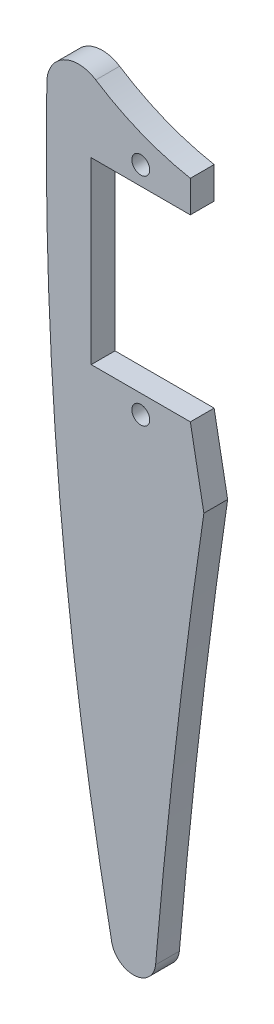
ISO-10303-21;
HEADER;
FILE_DESCRIPTION(('STEP AP214'),'2;1');
FILE_NAME('part.step','',(''),(''),'','','');
FILE_SCHEMA(('AUTOMOTIVE_DESIGN { 1 0 10303 214 1 1 1 1 }'));
ENDSEC;
DATA;
#1=APPLICATION_CONTEXT('core data for automotive mechanical design processes');
#2=APPLICATION_PROTOCOL_DEFINITION('international standard','automotive_design',2000,#1);
#3=PRODUCT_CONTEXT('',#1,'mechanical');
#4=PRODUCT('Part','Part','',(#3));
#5=PRODUCT_RELATED_PRODUCT_CATEGORY('part','',(#4));
#6=PRODUCT_DEFINITION_FORMATION('','',#4);
#7=PRODUCT_DEFINITION_CONTEXT('part definition',#1,'design');
#8=PRODUCT_DEFINITION('design','',#6,#7);
#9=PRODUCT_DEFINITION_SHAPE('','',#8);
#10=(LENGTH_UNIT() NAMED_UNIT(*) SI_UNIT(.MILLI.,.METRE.));
#11=(NAMED_UNIT(*) PLANE_ANGLE_UNIT() SI_UNIT($,.RADIAN.));
#12=(NAMED_UNIT(*) SI_UNIT($,.STERADIAN.) SOLID_ANGLE_UNIT());
#13=UNCERTAINTY_MEASURE_WITH_UNIT(LENGTH_MEASURE(1.E-05),#10,'distance_accuracy_value','');
#14=(GEOMETRIC_REPRESENTATION_CONTEXT(3) GLOBAL_UNCERTAINTY_ASSIGNED_CONTEXT((#13)) GLOBAL_UNIT_ASSIGNED_CONTEXT((#10,
#11,#12)) REPRESENTATION_CONTEXT('',''));
#15=CARTESIAN_POINT('',(0.,0.,0.));
#16=DIRECTION('',(0.,0.,1.));
#17=DIRECTION('',(1.,0.,0.));
#18=AXIS2_PLACEMENT_3D('',#15,#16,#17);
#19=CARTESIAN_POINT('',(12.4257124309921,47.9431884383788,3.));
#20=DIRECTION('',(0.,0.,-1.));
#21=DIRECTION('',(-1.,0.,0.));
#22=AXIS2_PLACEMENT_3D('',#19,#20,#21);
#23=CYLINDRICAL_SURFACE('',#22,33.2222391697763);
#24=CARTESIAN_POINT('',(12.4257124309921,47.9431884383788,0.));
#25=DIRECTION('',(0.,0.,1.));
#26=DIRECTION('',(1.,0.,0.));
#27=AXIS2_PLACEMENT_3D('',#24,#25,#26);
#28=CIRCLE('',#27,33.2222391697763);
#29=CARTESIAN_POINT('',(6.25,15.3,0.));
#30=VERTEX_POINT('',#29);
#31=CARTESIAN_POINT('',(-5.67041126126869,20.0819701813066,0.));
#32=VERTEX_POINT('',#31);
#33=EDGE_CURVE('E151',#30,#32,#28,.F.);
#34=ORIENTED_EDGE('',*,*,#33,.T.);
#35=DIRECTION('',(0.,0.,-1.));
#36=VECTOR('',#35,1.);
#37=CARTESIAN_POINT('',(-5.67041126126869,20.0819701813066,3.));
#38=LINE('',#37,#36);
#39=CARTESIAN_POINT('',(-5.67041126126869,20.0819701813066,3.));
#40=VERTEX_POINT('',#39);
#41=EDGE_CURVE('E11',#40,#32,#38,.T.);
#42=ORIENTED_EDGE('',*,*,#41,.F.);
#43=CARTESIAN_POINT('',(12.4257124309921,47.9431884383788,3.));
#44=DIRECTION('',(0.,0.,1.));
#45=DIRECTION('',(1.,0.,0.));
#46=AXIS2_PLACEMENT_3D('',#43,#44,#45);
#47=CIRCLE('',#46,33.2222391697763);
#48=CARTESIAN_POINT('',(6.25,15.3,3.));
#49=VERTEX_POINT('',#48);
#50=EDGE_CURVE('E174',#49,#40,#47,.F.);
#51=ORIENTED_EDGE('',*,*,#50,.F.);
#52=DIRECTION('',(0.,0.,-1.));
#53=VECTOR('',#52,1.);
#54=CARTESIAN_POINT('',(6.25,15.3,3.));
#55=LINE('',#54,#53);
#56=EDGE_CURVE('E150',#49,#30,#55,.T.);
#57=ORIENTED_EDGE('',*,*,#56,.T.);
#58=EDGE_LOOP('',(#34,#42,#51,#57));
#59=FACE_BOUND('',#58,.T.);
#60=ADVANCED_FACE('F41',(#59),#23,.F.);
#61=CARTESIAN_POINT('',(-7.84920765121508,16.7274439418569,3.));
#62=DIRECTION('',(0.,0.,-1.));
#63=DIRECTION('',(-1.,0.,0.));
#64=AXIS2_PLACEMENT_3D('',#61,#62,#63);
#65=CYLINDRICAL_SURFACE('',#64,4.);
#66=CARTESIAN_POINT('',(-7.84920765121508,16.7274439418569,0.));
#67=DIRECTION('',(0.,0.,1.));
#68=DIRECTION('',(1.,0.,0.));
#69=AXIS2_PLACEMENT_3D('',#66,#67,#68);
#70=CIRCLE('',#69,4.);
#71=CARTESIAN_POINT('',(-11.8486301514454,16.7954120568166,0.));
#72=VERTEX_POINT('',#71);
#73=EDGE_CURVE('E154',#32,#72,#70,.T.);
#74=ORIENTED_EDGE('',*,*,#73,.T.);
#75=DIRECTION('',(0.,0.,-1.));
#76=VECTOR('',#75,1.);
#77=CARTESIAN_POINT('',(-11.8486301514454,16.7954120568166,3.));
#78=LINE('',#77,#76);
#79=CARTESIAN_POINT('',(-11.8486301514454,16.7954120568166,3.));
#80=VERTEX_POINT('',#79);
#81=EDGE_CURVE('E49',#80,#72,#78,.T.);
#82=ORIENTED_EDGE('',*,*,#81,.F.);
#83=CARTESIAN_POINT('',(-7.84920765121508,16.7274439418569,3.));
#84=DIRECTION('',(0.,0.,1.));
#85=DIRECTION('',(1.,0.,0.));
#86=AXIS2_PLACEMENT_3D('',#83,#84,#85);
#87=CIRCLE('',#86,4.);
#88=EDGE_CURVE('E105',#40,#80,#87,.T.);
#89=ORIENTED_EDGE('',*,*,#88,.F.);
#90=ORIENTED_EDGE('',*,*,#41,.T.);
#91=EDGE_LOOP('',(#74,#82,#89,#90));
#92=FACE_BOUND('',#91,.T.);
#93=ADVANCED_FACE('F232',(#92),#65,.T.);
#94=CARTESIAN_POINT('',(407.180196931629,9.67423406450074,3.));
#95=DIRECTION('',(0.,0.,-1.));
#96=DIRECTION('',(-1.,0.,0.));
#97=AXIS2_PLACEMENT_3D('',#94,#95,#96);
#98=CYLINDRICAL_SURFACE('',#97,419.089333081403);
#99=CARTESIAN_POINT('',(407.180196931629,9.67423406450074,0.));
#100=DIRECTION('',(0.,0.,1.));
#101=DIRECTION('',(1.,0.,0.));
#102=AXIS2_PLACEMENT_3D('',#99,#100,#101);
#103=CIRCLE('',#102,419.089333081403);
#104=CARTESIAN_POINT('',(-3.71379160810283,-72.8000000000001,0.));
#105=VERTEX_POINT('',#104);
#106=EDGE_CURVE('E157',#72,#105,#103,.T.);
#107=ORIENTED_EDGE('',*,*,#106,.T.);
#108=DIRECTION('',(0.,0.,-1.));
#109=VECTOR('',#108,1.);
#110=CARTESIAN_POINT('',(-3.71379160810283,-72.8000000000001,3.));
#111=LINE('',#110,#109);
#112=CARTESIAN_POINT('',(-3.71379160810283,-72.8000000000001,3.));
#113=VERTEX_POINT('',#112);
#114=EDGE_CURVE('E184',#113,#105,#111,.T.);
#115=ORIENTED_EDGE('',*,*,#114,.F.);
#116=CARTESIAN_POINT('',(407.180196931629,9.67423406450074,3.));
#117=DIRECTION('',(0.,0.,1.));
#118=DIRECTION('',(1.,0.,0.));
#119=AXIS2_PLACEMENT_3D('',#116,#117,#118);
#120=CIRCLE('',#119,419.089333081403);
#121=EDGE_CURVE('E192',#80,#113,#120,.T.);
#122=ORIENTED_EDGE('',*,*,#121,.F.);
#123=ORIENTED_EDGE('',*,*,#81,.T.);
#124=EDGE_LOOP('',(#107,#115,#122,#123));
#125=FACE_BOUND('',#124,.T.);
#126=ADVANCED_FACE('F190',(#125),#98,.T.);
#127=CARTESIAN_POINT('',(-0.923786204053564,-72.4931739690752,3.));
#128=DIRECTION('',(0.,0.,-1.));
#129=DIRECTION('',(-1.,0.,0.));
#130=AXIS2_PLACEMENT_3D('',#127,#128,#129);
#131=CYLINDRICAL_SURFACE('',#130,2.80682603092483);
#132=CARTESIAN_POINT('',(-0.923786204053564,-72.4931739690752,0.));
#133=DIRECTION('',(0.,0.,1.));
#134=DIRECTION('',(1.,0.,0.));
#135=AXIS2_PLACEMENT_3D('',#132,#133,#134);
#136=CIRCLE('',#135,2.80682603092483);
#137=CARTESIAN_POINT('',(1.8662191999957,-72.8,0.));
#138=VERTEX_POINT('',#137);
#139=EDGE_CURVE('E159',#105,#138,#136,.T.);
#140=ORIENTED_EDGE('',*,*,#139,.T.);
#141=DIRECTION('',(0.,0.,-1.));
#142=VECTOR('',#141,1.);
#143=CARTESIAN_POINT('',(1.8662191999957,-72.8,3.));
#144=LINE('',#143,#142);
#145=CARTESIAN_POINT('',(1.8662191999957,-72.8,3.));
#146=VERTEX_POINT('',#145);
#147=EDGE_CURVE('E182',#146,#138,#144,.T.);
#148=ORIENTED_EDGE('',*,*,#147,.F.);
#149=CARTESIAN_POINT('',(-0.923786204053564,-72.4931739690752,3.));
#150=DIRECTION('',(0.,0.,1.));
#151=DIRECTION('',(1.,0.,0.));
#152=AXIS2_PLACEMENT_3D('',#149,#150,#151);
#153=CIRCLE('',#152,2.80682603092483);
#154=EDGE_CURVE('E203',#113,#146,#153,.T.);
#155=ORIENTED_EDGE('',*,*,#154,.F.);
#156=ORIENTED_EDGE('',*,*,#114,.T.);
#157=EDGE_LOOP('',(#140,#148,#155,#156));
#158=FACE_BOUND('',#157,.T.);
#159=ADVANCED_FACE('F200',(#158),#131,.T.);
#160=CARTESIAN_POINT('',(853.845250467086,-145.303475689597,3.));
#161=DIRECTION('',(0.,0.,-1.));
#162=DIRECTION('',(-1.,0.,0.));
#163=AXIS2_PLACEMENT_3D('',#160,#161,#162);
#164=CYLINDRICAL_SURFACE('',#163,855.058491394526);
#165=CARTESIAN_POINT('',(853.845250467086,-145.303475689597,0.));
#166=DIRECTION('',(0.,0.,1.));
#167=DIRECTION('',(1.,0.,0.));
#168=AXIS2_PLACEMENT_3D('',#165,#166,#167);
#169=CIRCLE('',#168,855.058491394526);
#170=CARTESIAN_POINT('',(7.954822861079,-20.4259028816252,0.));
#171=VERTEX_POINT('',#170);
#172=EDGE_CURVE('E162',#171,#138,#169,.T.);
#173=ORIENTED_EDGE('',*,*,#172,.F.);
#174=DIRECTION('',(0.,0.,-1.));
#175=VECTOR('',#174,1.);
#176=CARTESIAN_POINT('',(7.954822861079,-20.4259028816252,3.));
#177=LINE('',#176,#175);
#178=CARTESIAN_POINT('',(7.954822861079,-20.4259028816252,3.));
#179=VERTEX_POINT('',#178);
#180=EDGE_CURVE('E180',#179,#171,#177,.T.);
#181=ORIENTED_EDGE('',*,*,#180,.F.);
#182=CARTESIAN_POINT('',(853.845250467086,-145.303475689597,3.));
#183=DIRECTION('',(0.,0.,1.));
#184=DIRECTION('',(1.,0.,0.));
#185=AXIS2_PLACEMENT_3D('',#182,#183,#184);
#186=CIRCLE('',#185,855.058491394526);
#187=EDGE_CURVE('E205',#179,#146,#186,.T.);
#188=ORIENTED_EDGE('',*,*,#187,.T.);
#189=ORIENTED_EDGE('',*,*,#147,.T.);
#190=EDGE_LOOP('',(#173,#181,#188,#189));
#191=FACE_BOUND('',#190,.T.);
#192=ADVANCED_FACE('F243',(#191),#164,.F.);
#193=CARTESIAN_POINT('',(3.99945593552499,0.74714403596051,3.));
#194=DIRECTION('',(0.982994572660715,0.18363461035322,0.));
#195=DIRECTION('',(-0.18363461035322,0.982994572660715,0.));
#196=AXIS2_PLACEMENT_3D('',#193,#194,#195);
#197=PLANE('',#196);
#198=DIRECTION('',(0.18363461035322,-0.982994572660715,0.));
#199=VECTOR('',#198,1.);
#200=CARTESIAN_POINT('',(3.99945593552499,0.74714403596051,0.));
#201=LINE('',#200,#199);
#202=CARTESIAN_POINT('',(6.25,-11.3,0.));
#203=VERTEX_POINT('',#202);
#204=EDGE_CURVE('E165',#203,#171,#201,.T.);
#205=ORIENTED_EDGE('',*,*,#204,.F.);
#206=DIRECTION('',(0.,0.,-1.));
#207=VECTOR('',#206,1.);
#208=CARTESIAN_POINT('',(6.25,-11.3,3.));
#209=LINE('',#208,#207);
#210=CARTESIAN_POINT('',(6.25,-11.3,3.));
#211=VERTEX_POINT('',#210);
#212=EDGE_CURVE('E178',#211,#203,#209,.T.);
#213=ORIENTED_EDGE('',*,*,#212,.F.);
#214=DIRECTION('',(0.18363461035322,-0.982994572660715,0.));
#215=VECTOR('',#214,1.);
#216=CARTESIAN_POINT('',(3.99945593552499,0.74714403596051,3.));
#217=LINE('',#216,#215);
#218=EDGE_CURVE('E145',#211,#179,#217,.T.);
#219=ORIENTED_EDGE('',*,*,#218,.T.);
#220=ORIENTED_EDGE('',*,*,#180,.T.);
#221=EDGE_LOOP('',(#205,#213,#219,#220));
#222=FACE_BOUND('',#221,.T.);
#223=ADVANCED_FACE('F213',(#222),#197,.T.);
#224=CARTESIAN_POINT('',(0.,-11.3,3.));
#225=DIRECTION('',(0.,1.,0.));
#226=DIRECTION('',(0.,0.,1.));
#227=AXIS2_PLACEMENT_3D('',#224,#225,#226);
#228=PLANE('',#227);
#229=DIRECTION('',(1.,0.,0.));
#230=VECTOR('',#229,1.);
#231=CARTESIAN_POINT('',(0.,-11.3,0.));
#232=LINE('',#231,#230);
#233=CARTESIAN_POINT('',(-6.25,-11.3,0.));
#234=VERTEX_POINT('',#233);
#235=EDGE_CURVE('E168',#234,#203,#232,.T.);
#236=ORIENTED_EDGE('',*,*,#235,.F.);
#237=DIRECTION('',(0.,0.,-1.));
#238=VECTOR('',#237,1.);
#239=CARTESIAN_POINT('',(-6.25,-11.3,3.));
#240=LINE('',#239,#238);
#241=CARTESIAN_POINT('',(-6.25,-11.3,3.));
#242=VERTEX_POINT('',#241);
#243=EDGE_CURVE('E133',#242,#234,#240,.T.);
#244=ORIENTED_EDGE('',*,*,#243,.F.);
#245=DIRECTION('',(1.,0.,0.));
#246=VECTOR('',#245,1.);
#247=CARTESIAN_POINT('',(0.,-11.3,3.));
#248=LINE('',#247,#246);
#249=EDGE_CURVE('E143',#242,#211,#248,.T.);
#250=ORIENTED_EDGE('',*,*,#249,.T.);
#251=ORIENTED_EDGE('',*,*,#212,.T.);
#252=EDGE_LOOP('',(#236,#244,#250,#251));
#253=FACE_BOUND('',#252,.T.);
#254=ADVANCED_FACE('F216',(#253),#228,.T.);
#255=CARTESIAN_POINT('',(-6.25,0.,3.));
#256=DIRECTION('',(1.,0.,0.));
#257=DIRECTION('',(0.,1.,0.));
#258=AXIS2_PLACEMENT_3D('',#255,#256,#257);
#259=PLANE('',#258);
#260=DIRECTION('',(0.,-1.,0.));
#261=VECTOR('',#260,1.);
#262=CARTESIAN_POINT('',(-6.25,0.,0.));
#263=LINE('',#262,#261);
#264=CARTESIAN_POINT('',(-6.25,11.3,0.));
#265=VERTEX_POINT('',#264);
#266=EDGE_CURVE('E132',#265,#234,#263,.T.);
#267=ORIENTED_EDGE('',*,*,#266,.F.);
#268=DIRECTION('',(0.,0.,-1.));
#269=VECTOR('',#268,1.);
#270=CARTESIAN_POINT('',(-6.25,11.3,3.));
#271=LINE('',#270,#269);
#272=CARTESIAN_POINT('',(-6.25,11.3,3.));
#273=VERTEX_POINT('',#272);
#274=EDGE_CURVE('E126',#273,#265,#271,.T.);
#275=ORIENTED_EDGE('',*,*,#274,.F.);
#276=DIRECTION('',(0.,-1.,0.));
#277=VECTOR('',#276,1.);
#278=CARTESIAN_POINT('',(-6.25,0.,3.));
#279=LINE('',#278,#277);
#280=EDGE_CURVE('E130',#273,#242,#279,.T.);
#281=ORIENTED_EDGE('',*,*,#280,.T.);
#282=ORIENTED_EDGE('',*,*,#243,.T.);
#283=EDGE_LOOP('',(#267,#275,#281,#282));
#284=FACE_BOUND('',#283,.T.);
#285=ADVANCED_FACE('F128',(#284),#259,.T.);
#286=CARTESIAN_POINT('',(0.,11.3,3.));
#287=DIRECTION('',(0.,1.,0.));
#288=DIRECTION('',(-1.,0.,0.));
#289=AXIS2_PLACEMENT_3D('',#286,#287,#288);
#290=PLANE('',#289);
#291=DIRECTION('',(1.,0.,0.));
#292=VECTOR('',#291,1.);
#293=CARTESIAN_POINT('',(0.,11.3,0.));
#294=LINE('',#293,#292);
#295=CARTESIAN_POINT('',(6.25,11.3,0.));
#296=VERTEX_POINT('',#295);
#297=EDGE_CURVE('E91',#265,#296,#294,.T.);
#298=ORIENTED_EDGE('',*,*,#297,.T.);
#299=DIRECTION('',(0.,0.,-1.));
#300=VECTOR('',#299,1.);
#301=CARTESIAN_POINT('',(6.25,11.3,3.));
#302=LINE('',#301,#300);
#303=CARTESIAN_POINT('',(6.25,11.3,3.));
#304=VERTEX_POINT('',#303);
#305=EDGE_CURVE('E134',#304,#296,#302,.T.);
#306=ORIENTED_EDGE('',*,*,#305,.F.);
#307=DIRECTION('',(1.,0.,0.));
#308=VECTOR('',#307,1.);
#309=CARTESIAN_POINT('',(0.,11.3,3.));
#310=LINE('',#309,#308);
#311=EDGE_CURVE('E136',#273,#304,#310,.T.);
#312=ORIENTED_EDGE('',*,*,#311,.F.);
#313=ORIENTED_EDGE('',*,*,#274,.T.);
#314=EDGE_LOOP('',(#298,#306,#312,#313));
#315=FACE_BOUND('',#314,.T.);
#316=ADVANCED_FACE('F137',(#315),#290,.F.);
#317=CARTESIAN_POINT('',(6.25,0.,3.));
#318=DIRECTION('',(-1.,0.,0.));
#319=DIRECTION('',(0.,0.,1.));
#320=AXIS2_PLACEMENT_3D('',#317,#318,#319);
#321=PLANE('',#320);
#322=DIRECTION('',(0.,1.,0.));
#323=VECTOR('',#322,1.);
#324=CARTESIAN_POINT('',(6.25,0.,0.));
#325=LINE('',#324,#323);
#326=EDGE_CURVE('E97',#296,#30,#325,.T.);
#327=ORIENTED_EDGE('',*,*,#326,.T.);
#328=ORIENTED_EDGE('',*,*,#56,.F.);
#329=DIRECTION('',(0.,1.,0.));
#330=VECTOR('',#329,1.);
#331=CARTESIAN_POINT('',(6.25,0.,3.));
#332=LINE('',#331,#330);
#333=EDGE_CURVE('E57',#304,#49,#332,.T.);
#334=ORIENTED_EDGE('',*,*,#333,.F.);
#335=ORIENTED_EDGE('',*,*,#305,.T.);
#336=EDGE_LOOP('',(#327,#328,#334,#335));
#337=FACE_BOUND('',#336,.T.);
#338=ADVANCED_FACE('F220',(#337),#321,.F.);
#339=CARTESIAN_POINT('',(0.,0.,3.));
#340=DIRECTION('',(0.,0.,1.));
#341=DIRECTION('',(1.,0.,0.));
#342=AXIS2_PLACEMENT_3D('',#339,#340,#341);
#343=PLANE('',#342);
#344=CARTESIAN_POINT('',(0.,13.65,3.));
#345=DIRECTION('',(0.,0.,1.));
#346=DIRECTION('',(1.,0.,0.));
#347=AXIS2_PLACEMENT_3D('',#344,#345,#346);
#348=CIRCLE('',#347,1.125);
#349=CARTESIAN_POINT('',(1.125,13.65,3.));
#350=VERTEX_POINT('',#349);
#351=EDGE_CURVE('E307',#350,#350,#348,.T.);
#352=ORIENTED_EDGE('',*,*,#351,.F.);
#353=EDGE_LOOP('',(#352));
#354=FACE_BOUND('',#353,.T.);
#355=CARTESIAN_POINT('',(0.,-13.65,3.));
#356=DIRECTION('',(0.,0.,1.));
#357=DIRECTION('',(1.,0.,0.));
#358=AXIS2_PLACEMENT_3D('',#355,#356,#357);
#359=CIRCLE('',#358,1.125);
#360=CARTESIAN_POINT('',(1.125,-13.65,3.));
#361=VERTEX_POINT('',#360);
#362=EDGE_CURVE('E312',#361,#361,#359,.T.);
#363=ORIENTED_EDGE('',*,*,#362,.F.);
#364=EDGE_LOOP('',(#363));
#365=FACE_BOUND('',#364,.T.);
#366=ORIENTED_EDGE('',*,*,#50,.T.);
#367=ORIENTED_EDGE('',*,*,#88,.T.);
#368=ORIENTED_EDGE('',*,*,#121,.T.);
#369=ORIENTED_EDGE('',*,*,#154,.T.);
#370=ORIENTED_EDGE('',*,*,#187,.F.);
#371=ORIENTED_EDGE('',*,*,#218,.F.);
#372=ORIENTED_EDGE('',*,*,#249,.F.);
#373=ORIENTED_EDGE('',*,*,#280,.F.);
#374=ORIENTED_EDGE('',*,*,#311,.T.);
#375=ORIENTED_EDGE('',*,*,#333,.T.);
#376=EDGE_LOOP('',(#366,#367,#368,#369,#370,#371,#372,#373,#374,#375));
#377=FACE_BOUND('',#376,.T.);
#378=ADVANCED_FACE('F140',(#354,#365,#377),#343,.T.);
#379=CARTESIAN_POINT('',(0.,0.,0.));
#380=DIRECTION('',(0.,0.,1.));
#381=DIRECTION('',(1.,0.,0.));
#382=AXIS2_PLACEMENT_3D('',#379,#380,#381);
#383=PLANE('',#382);
#384=CARTESIAN_POINT('',(0.,13.65,0.));
#385=DIRECTION('',(0.,0.,1.));
#386=DIRECTION('',(1.,0.,0.));
#387=AXIS2_PLACEMENT_3D('',#384,#385,#386);
#388=CIRCLE('',#387,1.125);
#389=CARTESIAN_POINT('',(1.125,13.65,0.));
#390=VERTEX_POINT('',#389);
#391=EDGE_CURVE('E155',#390,#390,#388,.F.);
#392=ORIENTED_EDGE('',*,*,#391,.F.);
#393=EDGE_LOOP('',(#392));
#394=FACE_BOUND('',#393,.T.);
#395=CARTESIAN_POINT('',(0.,-13.65,0.));
#396=DIRECTION('',(0.,0.,1.));
#397=DIRECTION('',(1.,0.,0.));
#398=AXIS2_PLACEMENT_3D('',#395,#396,#397);
#399=CIRCLE('',#398,1.125);
#400=CARTESIAN_POINT('',(1.125,-13.65,0.));
#401=VERTEX_POINT('',#400);
#402=EDGE_CURVE('E308',#401,#401,#399,.F.);
#403=ORIENTED_EDGE('',*,*,#402,.F.);
#404=EDGE_LOOP('',(#403));
#405=FACE_BOUND('',#404,.T.);
#406=ORIENTED_EDGE('',*,*,#33,.F.);
#407=ORIENTED_EDGE('',*,*,#326,.F.);
#408=ORIENTED_EDGE('',*,*,#297,.F.);
#409=ORIENTED_EDGE('',*,*,#266,.T.);
#410=ORIENTED_EDGE('',*,*,#235,.T.);
#411=ORIENTED_EDGE('',*,*,#204,.T.);
#412=ORIENTED_EDGE('',*,*,#172,.T.);
#413=ORIENTED_EDGE('',*,*,#139,.F.);
#414=ORIENTED_EDGE('',*,*,#106,.F.);
#415=ORIENTED_EDGE('',*,*,#73,.F.);
#416=EDGE_LOOP('',(#406,#407,#408,#409,#410,#411,#412,#413,#414,#415));
#417=FACE_BOUND('',#416,.T.);
#418=ADVANCED_FACE('F196',(#394,#405,#417),#383,.F.);
#419=CARTESIAN_POINT('',(0.,-13.65,-3.18198051533946));
#420=DIRECTION('',(0.,0.,1.));
#421=DIRECTION('',(1.,0.,0.));
#422=AXIS2_PLACEMENT_3D('',#419,#420,#421);
#423=CYLINDRICAL_SURFACE('',#422,1.125);
#424=ORIENTED_EDGE('',*,*,#402,.T.);
#425=EDGE_LOOP('',(#424));
#426=FACE_BOUND('',#425,.T.);
#427=ORIENTED_EDGE('',*,*,#362,.T.);
#428=EDGE_LOOP('',(#427));
#429=FACE_BOUND('',#428,.T.);
#430=ADVANCED_FACE('F279',(#426,#429),#423,.F.);
#431=CARTESIAN_POINT('',(0.,13.65,-3.18198051533946));
#432=DIRECTION('',(0.,0.,1.));
#433=DIRECTION('',(1.,0.,0.));
#434=AXIS2_PLACEMENT_3D('',#431,#432,#433);
#435=CYLINDRICAL_SURFACE('',#434,1.125);
#436=ORIENTED_EDGE('',*,*,#391,.T.);
#437=EDGE_LOOP('',(#436));
#438=FACE_BOUND('',#437,.T.);
#439=ORIENTED_EDGE('',*,*,#351,.T.);
#440=EDGE_LOOP('',(#439));
#441=FACE_BOUND('',#440,.T.);
#442=ADVANCED_FACE('F288',(#438,#441),#435,.F.);
#443=CLOSED_SHELL('',(#60,#93,#126,#159,#192,#223,#254,#285,#316,#338,#378,#418,#430,#442));
#444=MANIFOLD_SOLID_BREP('B2',#443);
#445=ADVANCED_BREP_SHAPE_REPRESENTATION('',(#18,#444),#14);
#446=SHAPE_DEFINITION_REPRESENTATION(#9,#445);
ENDSEC;
END-ISO-10303-21;
